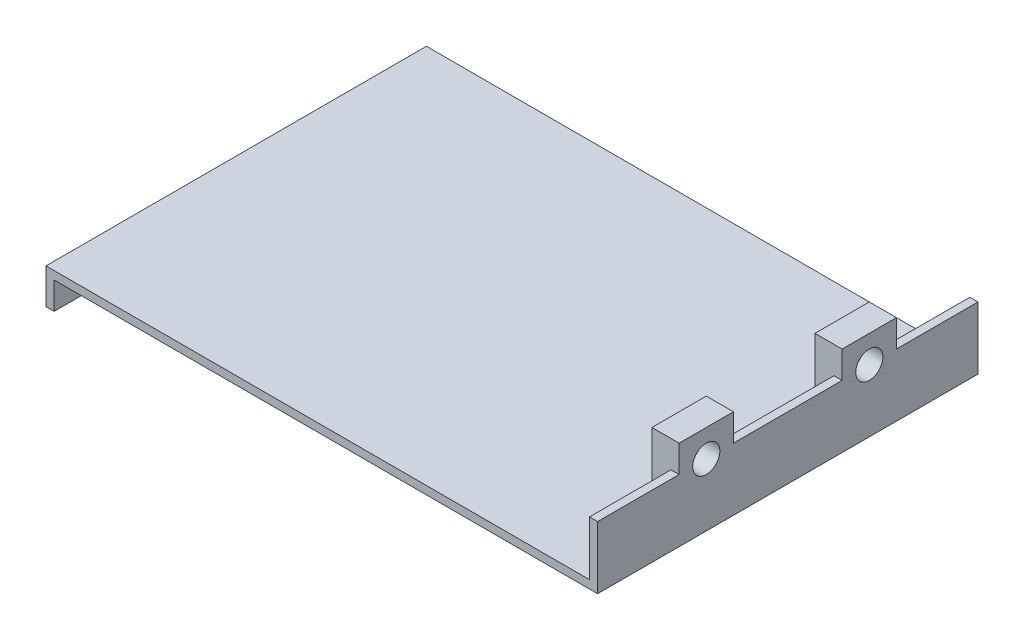
ISO-10303-21;
HEADER;
FILE_DESCRIPTION(('STEP AP214'),'2;1');
FILE_NAME('part.step','',(''),(''),'','','');
FILE_SCHEMA(('AUTOMOTIVE_DESIGN { 1 0 10303 214 1 1 1 1 }'));
ENDSEC;
DATA;
#1=APPLICATION_CONTEXT('core data for automotive mechanical design processes');
#2=APPLICATION_PROTOCOL_DEFINITION('international standard','automotive_design',2000,#1);
#3=PRODUCT_CONTEXT('',#1,'mechanical');
#4=PRODUCT('Part','Part','',(#3));
#5=PRODUCT_RELATED_PRODUCT_CATEGORY('part','',(#4));
#6=PRODUCT_DEFINITION_FORMATION('','',#4);
#7=PRODUCT_DEFINITION_CONTEXT('part definition',#1,'design');
#8=PRODUCT_DEFINITION('design','',#6,#7);
#9=PRODUCT_DEFINITION_SHAPE('','',#8);
#10=(LENGTH_UNIT() NAMED_UNIT(*) SI_UNIT(.MILLI.,.METRE.));
#11=(NAMED_UNIT(*) PLANE_ANGLE_UNIT() SI_UNIT($,.RADIAN.));
#12=(NAMED_UNIT(*) SI_UNIT($,.STERADIAN.) SOLID_ANGLE_UNIT());
#13=UNCERTAINTY_MEASURE_WITH_UNIT(LENGTH_MEASURE(1.E-05),#10,'distance_accuracy_value','');
#14=(GEOMETRIC_REPRESENTATION_CONTEXT(3) GLOBAL_UNCERTAINTY_ASSIGNED_CONTEXT((#13)) GLOBAL_UNIT_ASSIGNED_CONTEXT((#10,
#11,#12)) REPRESENTATION_CONTEXT('',''));
#15=CARTESIAN_POINT('',(0.,0.,0.));
#16=DIRECTION('',(0.,0.,1.));
#17=DIRECTION('',(1.,0.,0.));
#18=AXIS2_PLACEMENT_3D('',#15,#16,#17);
#19=CARTESIAN_POINT('',(0.,1.5,0.));
#20=DIRECTION('',(0.,1.,0.));
#21=DIRECTION('',(0.,0.,1.));
#22=AXIS2_PLACEMENT_3D('',#19,#20,#21);
#23=PLANE('',#22);
#24=DIRECTION('',(0.,0.,-1.));
#25=VECTOR('',#24,1.);
#26=CARTESIAN_POINT('',(35.34812024223,1.5,0.));
#27=LINE('',#26,#25);
#28=CARTESIAN_POINT('',(35.34812024223,1.5,4.92398703403566));
#29=VERTEX_POINT('',#28);
#30=CARTESIAN_POINT('',(35.34812024223,1.5,-15.0760129659643));
#31=VERTEX_POINT('',#30);
#32=EDGE_CURVE('E246',#29,#31,#27,.T.);
#33=ORIENTED_EDGE('',*,*,#32,.T.);
#34=DIRECTION('',(1.,0.,0.));
#35=VECTOR('',#34,1.);
#36=CARTESIAN_POINT('',(31.84812024223,1.5,-15.0760129659643));
#37=LINE('',#36,#35);
#38=CARTESIAN_POINT('',(31.84812024223,1.5,-15.0760129659643));
#39=VERTEX_POINT('',#38);
#40=EDGE_CURVE('E226',#39,#31,#37,.T.);
#41=ORIENTED_EDGE('',*,*,#40,.F.);
#42=DIRECTION('',(0.,0.,1.));
#43=VECTOR('',#42,1.);
#44=CARTESIAN_POINT('',(31.84812024223,1.5,0.));
#45=LINE('',#44,#43);
#46=CARTESIAN_POINT('',(31.84812024223,1.5,-25.0760129659643));
#47=VERTEX_POINT('',#46);
#48=EDGE_CURVE('E234',#47,#39,#45,.T.);
#49=ORIENTED_EDGE('',*,*,#48,.F.);
#50=DIRECTION('',(1.,0.,0.));
#51=VECTOR('',#50,1.);
#52=CARTESIAN_POINT('',(31.84812024223,1.5,-25.0760129659643));
#53=LINE('',#52,#51);
#54=CARTESIAN_POINT('',(35.34812024223,1.5,-25.0760129659643));
#55=VERTEX_POINT('',#54);
#56=EDGE_CURVE('E248',#47,#55,#53,.T.);
#57=ORIENTED_EDGE('',*,*,#56,.T.);
#58=CARTESIAN_POINT('',(35.34812024223,1.5,-40.0760129659643));
#59=VERTEX_POINT('',#58);
#60=EDGE_CURVE('E106',#55,#59,#27,.T.);
#61=ORIENTED_EDGE('',*,*,#60,.T.);
#62=DIRECTION('',(1.,0.,0.));
#63=VECTOR('',#62,1.);
#64=CARTESIAN_POINT('',(0.,1.5,-40.0760129659643));
#65=LINE('',#64,#63);
#66=CARTESIAN_POINT('',(-64.65187975777,1.5,-40.0760129659643));
#67=VERTEX_POINT('',#66);
#68=EDGE_CURVE('E327',#67,#59,#65,.T.);
#69=ORIENTED_EDGE('',*,*,#68,.F.);
#70=DIRECTION('',(0.,0.,1.));
#71=VECTOR('',#70,1.);
#72=CARTESIAN_POINT('',(-64.65187975777,1.5,-40.0760129659643));
#73=LINE('',#72,#71);
#74=CARTESIAN_POINT('',(-64.65187975777,1.5,29.9239870340357));
#75=VERTEX_POINT('',#74);
#76=EDGE_CURVE('E337',#67,#75,#73,.T.);
#77=ORIENTED_EDGE('',*,*,#76,.T.);
#78=DIRECTION('',(1.,0.,0.));
#79=VECTOR('',#78,1.);
#80=CARTESIAN_POINT('',(0.,1.5,29.9239870340357));
#81=LINE('',#80,#79);
#82=CARTESIAN_POINT('',(35.34812024223,1.5,29.9239870340357));
#83=VERTEX_POINT('',#82);
#84=EDGE_CURVE('E330',#75,#83,#81,.T.);
#85=ORIENTED_EDGE('',*,*,#84,.T.);
#86=CARTESIAN_POINT('',(35.34812024223,1.5,14.9239870340357));
#87=VERTEX_POINT('',#86);
#88=EDGE_CURVE('E307',#83,#87,#27,.T.);
#89=ORIENTED_EDGE('',*,*,#88,.T.);
#90=DIRECTION('',(1.,0.,0.));
#91=VECTOR('',#90,1.);
#92=CARTESIAN_POINT('',(31.84812024223,1.5,14.9239870340357));
#93=LINE('',#92,#91);
#94=CARTESIAN_POINT('',(31.84812024223,1.5,14.9239870340357));
#95=VERTEX_POINT('',#94);
#96=EDGE_CURVE('E264',#95,#87,#93,.T.);
#97=ORIENTED_EDGE('',*,*,#96,.F.);
#98=DIRECTION('',(0.,0.,1.));
#99=VECTOR('',#98,1.);
#100=CARTESIAN_POINT('',(31.84812024223,1.5,0.));
#101=LINE('',#100,#99);
#102=CARTESIAN_POINT('',(31.84812024223,1.5,4.92398703403566));
#103=VERTEX_POINT('',#102);
#104=EDGE_CURVE('E260',#103,#95,#101,.T.);
#105=ORIENTED_EDGE('',*,*,#104,.F.);
#106=DIRECTION('',(1.,0.,0.));
#107=VECTOR('',#106,1.);
#108=CARTESIAN_POINT('',(31.84812024223,1.5,4.92398703403566));
#109=LINE('',#108,#107);
#110=EDGE_CURVE('E269',#103,#29,#109,.T.);
#111=ORIENTED_EDGE('',*,*,#110,.T.);
#112=EDGE_LOOP('',(#33,#41,#49,#57,#61,#69,#77,#85,#89,#97,#105,#111));
#113=FACE_BOUND('',#112,.T.);
#114=ADVANCED_FACE('F83',(#113),#23,.T.);
#115=CARTESIAN_POINT('',(35.34812024223,11.5,0.));
#116=DIRECTION('',(-1.,0.,0.));
#117=DIRECTION('',(0.,0.,1.));
#118=AXIS2_PLACEMENT_3D('',#115,#116,#117);
#119=PLANE('',#118);
#120=DIRECTION('',(0.,0.,-1.));
#121=VECTOR('',#120,1.);
#122=CARTESIAN_POINT('',(35.34812024223,11.5,0.));
#123=LINE('',#122,#121);
#124=CARTESIAN_POINT('',(35.34812024223,11.5,4.92398703403566));
#125=VERTEX_POINT('',#124);
#126=CARTESIAN_POINT('',(35.34812024223,11.5,-15.0760129659643));
#127=VERTEX_POINT('',#126);
#128=EDGE_CURVE('E320',#125,#127,#123,.T.);
#129=ORIENTED_EDGE('',*,*,#128,.T.);
#130=DIRECTION('',(0.,1.,0.));
#131=VECTOR('',#130,1.);
#132=CARTESIAN_POINT('',(35.34812024223,11.5,-15.0760129659643));
#133=LINE('',#132,#131);
#134=EDGE_CURVE('E416',#31,#127,#133,.T.);
#135=ORIENTED_EDGE('',*,*,#134,.F.);
#136=ORIENTED_EDGE('',*,*,#32,.F.);
#137=DIRECTION('',(0.,-1.,0.));
#138=VECTOR('',#137,1.);
#139=CARTESIAN_POINT('',(35.34812024223,11.5,4.92398703403566));
#140=LINE('',#139,#138);
#141=EDGE_CURVE('E247',#125,#29,#140,.T.);
#142=ORIENTED_EDGE('',*,*,#141,.F.);
#143=EDGE_LOOP('',(#129,#135,#136,#142));
#144=FACE_BOUND('',#143,.T.);
#145=ADVANCED_FACE('F415',(#144),#119,.T.);
#146=DIRECTION('',(0.,1.,0.));
#147=VECTOR('',#146,1.);
#148=CARTESIAN_POINT('',(35.34812024223,11.5,-25.0760129659643));
#149=LINE('',#148,#147);
#150=CARTESIAN_POINT('',(35.34812024223,11.5,-25.0760129659643));
#151=VERTEX_POINT('',#150);
#152=EDGE_CURVE('E241',#55,#151,#149,.T.);
#153=ORIENTED_EDGE('',*,*,#152,.T.);
#154=CARTESIAN_POINT('',(35.34812024223,11.5,-40.0760129659643));
#155=VERTEX_POINT('',#154);
#156=EDGE_CURVE('E315',#151,#155,#123,.T.);
#157=ORIENTED_EDGE('',*,*,#156,.T.);
#158=DIRECTION('',(0.,-1.,0.));
#159=VECTOR('',#158,1.);
#160=CARTESIAN_POINT('',(35.34812024223,11.5,-40.0760129659643));
#161=LINE('',#160,#159);
#162=EDGE_CURVE('E323',#155,#59,#161,.T.);
#163=ORIENTED_EDGE('',*,*,#162,.T.);
#164=ORIENTED_EDGE('',*,*,#60,.F.);
#165=EDGE_LOOP('',(#153,#157,#163,#164));
#166=FACE_BOUND('',#165,.T.);
#167=ADVANCED_FACE('F466',(#166),#119,.T.);
#168=CARTESIAN_POINT('',(0.,11.5,0.));
#169=DIRECTION('',(0.,1.,0.));
#170=DIRECTION('',(0.,0.,1.));
#171=AXIS2_PLACEMENT_3D('',#168,#169,#170);
#172=PLANE('',#171);
#173=DIRECTION('',(0.,0.,-1.));
#174=VECTOR('',#173,1.);
#175=CARTESIAN_POINT('',(36.84812024223,11.5,0.));
#176=LINE('',#175,#174);
#177=CARTESIAN_POINT('',(36.84812024223,11.5,4.92398703403566));
#178=VERTEX_POINT('',#177);
#179=CARTESIAN_POINT('',(36.84812024223,11.5,-15.0760129659643));
#180=VERTEX_POINT('',#179);
#181=EDGE_CURVE('E312',#178,#180,#176,.T.);
#182=ORIENTED_EDGE('',*,*,#181,.T.);
#183=DIRECTION('',(1.,0.,0.));
#184=VECTOR('',#183,1.);
#185=CARTESIAN_POINT('',(35.34812024223,11.5,-15.0760129659643));
#186=LINE('',#185,#184);
#187=EDGE_CURVE('E280',#127,#180,#186,.T.);
#188=ORIENTED_EDGE('',*,*,#187,.F.);
#189=ORIENTED_EDGE('',*,*,#128,.F.);
#190=DIRECTION('',(1.,0.,0.));
#191=VECTOR('',#190,1.);
#192=CARTESIAN_POINT('',(35.34812024223,11.5,4.92398703403566));
#193=LINE('',#192,#191);
#194=EDGE_CURVE('E300',#125,#178,#193,.T.);
#195=ORIENTED_EDGE('',*,*,#194,.T.);
#196=EDGE_LOOP('',(#182,#188,#189,#195));
#197=FACE_BOUND('',#196,.T.);
#198=ADVANCED_FACE('F487',(#197),#172,.T.);
#199=DIRECTION('',(1.,0.,0.));
#200=VECTOR('',#199,1.);
#201=CARTESIAN_POINT('',(35.34812024223,11.5,-25.0760129659643));
#202=LINE('',#201,#200);
#203=CARTESIAN_POINT('',(36.84812024223,11.5,-25.0760129659643));
#204=VERTEX_POINT('',#203);
#205=EDGE_CURVE('E279',#151,#204,#202,.T.);
#206=ORIENTED_EDGE('',*,*,#205,.T.);
#207=CARTESIAN_POINT('',(36.84812024223,11.5,-40.0760129659643));
#208=VERTEX_POINT('',#207);
#209=EDGE_CURVE('E306',#204,#208,#176,.T.);
#210=ORIENTED_EDGE('',*,*,#209,.T.);
#211=DIRECTION('',(1.,0.,0.));
#212=VECTOR('',#211,1.);
#213=CARTESIAN_POINT('',(0.,11.5,-40.0760129659643));
#214=LINE('',#213,#212);
#215=EDGE_CURVE('E303',#155,#208,#214,.T.);
#216=ORIENTED_EDGE('',*,*,#215,.F.);
#217=ORIENTED_EDGE('',*,*,#156,.F.);
#218=EDGE_LOOP('',(#206,#210,#216,#217));
#219=FACE_BOUND('',#218,.T.);
#220=ADVANCED_FACE('F483',(#219),#172,.T.);
#221=CARTESIAN_POINT('',(-63.15187975777,-5.,-40.0760129659643));
#222=DIRECTION('',(-1.,0.,0.));
#223=DIRECTION('',(0.,0.,1.));
#224=AXIS2_PLACEMENT_3D('',#221,#222,#223);
#225=PLANE('',#224);
#226=DIRECTION('',(0.,0.,1.));
#227=VECTOR('',#226,1.);
#228=CARTESIAN_POINT('',(-63.15187975777,0.,-40.0760129659643));
#229=LINE('',#228,#227);
#230=CARTESIAN_POINT('',(-63.15187975777,0.,-40.0760129659643));
#231=VERTEX_POINT('',#230);
#232=CARTESIAN_POINT('',(-63.15187975777,0.,29.9239870340357));
#233=VERTEX_POINT('',#232);
#234=EDGE_CURVE('E334',#231,#233,#229,.T.);
#235=ORIENTED_EDGE('',*,*,#234,.T.);
#236=DIRECTION('',(0.,1.,0.));
#237=VECTOR('',#236,1.);
#238=CARTESIAN_POINT('',(-63.15187975777,-5.,29.9239870340357));
#239=LINE('',#238,#237);
#240=CARTESIAN_POINT('',(-63.15187975777,-5.,29.9239870340357));
#241=VERTEX_POINT('',#240);
#242=EDGE_CURVE('E12',#241,#233,#239,.T.);
#243=ORIENTED_EDGE('',*,*,#242,.F.);
#244=DIRECTION('',(0.,0.,1.));
#245=VECTOR('',#244,1.);
#246=CARTESIAN_POINT('',(-63.15187975777,-5.,-40.0760129659643));
#247=LINE('',#246,#245);
#248=CARTESIAN_POINT('',(-63.15187975777,-5.,-40.0760129659643));
#249=VERTEX_POINT('',#248);
#250=EDGE_CURVE('E349',#249,#241,#247,.T.);
#251=ORIENTED_EDGE('',*,*,#250,.F.);
#252=DIRECTION('',(0.,1.,0.));
#253=VECTOR('',#252,1.);
#254=CARTESIAN_POINT('',(-63.15187975777,-5.,-40.0760129659643));
#255=LINE('',#254,#253);
#256=EDGE_CURVE('E360',#249,#231,#255,.T.);
#257=ORIENTED_EDGE('',*,*,#256,.T.);
#258=EDGE_LOOP('',(#235,#243,#251,#257));
#259=FACE_BOUND('',#258,.T.);
#260=ADVANCED_FACE('F85',(#259),#225,.F.);
#261=CARTESIAN_POINT('',(-63.15187975777,-5.,29.9239870340357));
#262=DIRECTION('',(0.,0.,-1.));
#263=DIRECTION('',(-1.,0.,0.));
#264=AXIS2_PLACEMENT_3D('',#261,#262,#263);
#265=PLANE('',#264);
#266=ORIENTED_EDGE('',*,*,#242,.T.);
#267=DIRECTION('',(1.,0.,0.));
#268=VECTOR('',#267,1.);
#269=CARTESIAN_POINT('',(0.,0.,29.9239870340357));
#270=LINE('',#269,#268);
#271=CARTESIAN_POINT('',(36.84812024223,0.,29.9239870340357));
#272=VERTEX_POINT('',#271);
#273=EDGE_CURVE('E331',#233,#272,#270,.T.);
#274=ORIENTED_EDGE('',*,*,#273,.T.);
#275=DIRECTION('',(0.,-1.,0.));
#276=VECTOR('',#275,1.);
#277=CARTESIAN_POINT('',(36.84812024223,1.5,29.9239870340357));
#278=LINE('',#277,#276);
#279=CARTESIAN_POINT('',(36.84812024223,11.5,29.9239870340357));
#280=VERTEX_POINT('',#279);
#281=EDGE_CURVE('E344',#280,#272,#278,.T.);
#282=ORIENTED_EDGE('',*,*,#281,.F.);
#283=DIRECTION('',(1.,0.,0.));
#284=VECTOR('',#283,1.);
#285=CARTESIAN_POINT('',(0.,11.5,29.9239870340357));
#286=LINE('',#285,#284);
#287=CARTESIAN_POINT('',(35.34812024223,11.5,29.9239870340357));
#288=VERTEX_POINT('',#287);
#289=EDGE_CURVE('E311',#288,#280,#286,.T.);
#290=ORIENTED_EDGE('',*,*,#289,.F.);
#291=DIRECTION('',(0.,-1.,0.));
#292=VECTOR('',#291,1.);
#293=CARTESIAN_POINT('',(35.34812024223,11.5,29.9239870340357));
#294=LINE('',#293,#292);
#295=EDGE_CURVE('E319',#288,#83,#294,.T.);
#296=ORIENTED_EDGE('',*,*,#295,.T.);
#297=ORIENTED_EDGE('',*,*,#84,.F.);
#298=DIRECTION('',(0.,1.,0.));
#299=VECTOR('',#298,1.);
#300=CARTESIAN_POINT('',(-64.65187975777,-5.,29.9239870340357));
#301=LINE('',#300,#299);
#302=CARTESIAN_POINT('',(-64.65187975777,-5.,29.9239870340357));
#303=VERTEX_POINT('',#302);
#304=EDGE_CURVE('E91',#303,#75,#301,.T.);
#305=ORIENTED_EDGE('',*,*,#304,.F.);
#306=DIRECTION('',(-1.,0.,0.));
#307=VECTOR('',#306,1.);
#308=CARTESIAN_POINT('',(-63.15187975777,-5.,29.9239870340357));
#309=LINE('',#308,#307);
#310=EDGE_CURVE('E352',#241,#303,#309,.T.);
#311=ORIENTED_EDGE('',*,*,#310,.F.);
#312=EDGE_LOOP('',(#266,#274,#282,#290,#296,#297,#305,#311));
#313=FACE_BOUND('',#312,.T.);
#314=ADVANCED_FACE('F373',(#313),#265,.F.);
#315=CARTESIAN_POINT('',(-64.65187975777,-5.,-40.0760129659643));
#316=DIRECTION('',(-1.,0.,0.));
#317=DIRECTION('',(0.,0.,1.));
#318=AXIS2_PLACEMENT_3D('',#315,#316,#317);
#319=PLANE('',#318);
#320=ORIENTED_EDGE('',*,*,#304,.T.);
#321=ORIENTED_EDGE('',*,*,#76,.F.);
#322=DIRECTION('',(0.,1.,0.));
#323=VECTOR('',#322,1.);
#324=CARTESIAN_POINT('',(-64.65187975777,-5.,-40.0760129659643));
#325=LINE('',#324,#323);
#326=CARTESIAN_POINT('',(-64.65187975777,-5.,-40.0760129659643));
#327=VERTEX_POINT('',#326);
#328=EDGE_CURVE('E365',#327,#67,#325,.T.);
#329=ORIENTED_EDGE('',*,*,#328,.F.);
#330=DIRECTION('',(0.,0.,1.));
#331=VECTOR('',#330,1.);
#332=CARTESIAN_POINT('',(-64.65187975777,-5.,-40.0760129659643));
#333=LINE('',#332,#331);
#334=EDGE_CURVE('E354',#327,#303,#333,.T.);
#335=ORIENTED_EDGE('',*,*,#334,.T.);
#336=EDGE_LOOP('',(#320,#321,#329,#335));
#337=FACE_BOUND('',#336,.T.);
#338=ADVANCED_FACE('F370',(#337),#319,.T.);
#339=CARTESIAN_POINT('',(-63.15187975777,-5.,-40.0760129659643));
#340=DIRECTION('',(0.,0.,-1.));
#341=DIRECTION('',(-1.,0.,0.));
#342=AXIS2_PLACEMENT_3D('',#339,#340,#341);
#343=PLANE('',#342);
#344=ORIENTED_EDGE('',*,*,#328,.T.);
#345=ORIENTED_EDGE('',*,*,#68,.T.);
#346=ORIENTED_EDGE('',*,*,#162,.F.);
#347=ORIENTED_EDGE('',*,*,#215,.T.);
#348=DIRECTION('',(0.,-1.,0.));
#349=VECTOR('',#348,1.);
#350=CARTESIAN_POINT('',(36.84812024223,1.5,-40.0760129659643));
#351=LINE('',#350,#349);
#352=CARTESIAN_POINT('',(36.84812024223,0.,-40.0760129659643));
#353=VERTEX_POINT('',#352);
#354=EDGE_CURVE('E341',#208,#353,#351,.T.);
#355=ORIENTED_EDGE('',*,*,#354,.T.);
#356=DIRECTION('',(1.,0.,0.));
#357=VECTOR('',#356,1.);
#358=CARTESIAN_POINT('',(0.,0.,-40.0760129659643));
#359=LINE('',#358,#357);
#360=EDGE_CURVE('E335',#231,#353,#359,.T.);
#361=ORIENTED_EDGE('',*,*,#360,.F.);
#362=ORIENTED_EDGE('',*,*,#256,.F.);
#363=DIRECTION('',(-1.,0.,0.));
#364=VECTOR('',#363,1.);
#365=CARTESIAN_POINT('',(-63.15187975777,-5.,-40.0760129659643));
#366=LINE('',#365,#364);
#367=EDGE_CURVE('E357',#249,#327,#366,.T.);
#368=ORIENTED_EDGE('',*,*,#367,.T.);
#369=EDGE_LOOP('',(#344,#345,#346,#347,#355,#361,#362,#368));
#370=FACE_BOUND('',#369,.T.);
#371=ADVANCED_FACE('F378',(#370),#343,.T.);
#372=CARTESIAN_POINT('',(0.,-5.,0.));
#373=DIRECTION('',(0.,-1.,0.));
#374=DIRECTION('',(0.,0.,-1.));
#375=AXIS2_PLACEMENT_3D('',#372,#373,#374);
#376=PLANE('',#375);
#377=ORIENTED_EDGE('',*,*,#250,.T.);
#378=ORIENTED_EDGE('',*,*,#310,.T.);
#379=ORIENTED_EDGE('',*,*,#334,.F.);
#380=ORIENTED_EDGE('',*,*,#367,.F.);
#381=EDGE_LOOP('',(#377,#378,#379,#380));
#382=FACE_BOUND('',#381,.T.);
#383=ADVANCED_FACE('F382',(#382),#376,.T.);
#384=CARTESIAN_POINT('',(0.,0.,0.));
#385=DIRECTION('',(0.,1.,0.));
#386=DIRECTION('',(0.,0.,1.));
#387=AXIS2_PLACEMENT_3D('',#384,#385,#386);
#388=PLANE('',#387);
#389=ORIENTED_EDGE('',*,*,#234,.F.);
#390=ORIENTED_EDGE('',*,*,#360,.T.);
#391=DIRECTION('',(0.,0.,1.));
#392=VECTOR('',#391,1.);
#393=CARTESIAN_POINT('',(36.84812024223,0.,-40.0760129659643));
#394=LINE('',#393,#392);
#395=EDGE_CURVE('E325',#353,#272,#394,.T.);
#396=ORIENTED_EDGE('',*,*,#395,.T.);
#397=ORIENTED_EDGE('',*,*,#273,.F.);
#398=EDGE_LOOP('',(#389,#390,#396,#397));
#399=FACE_BOUND('',#398,.T.);
#400=ADVANCED_FACE('F388',(#399),#388,.F.);
#401=CARTESIAN_POINT('',(36.84812024223,1.5,-40.0760129659643));
#402=DIRECTION('',(1.,0.,0.));
#403=DIRECTION('',(0.,0.,-1.));
#404=AXIS2_PLACEMENT_3D('',#401,#402,#403);
#405=PLANE('',#404);
#406=CARTESIAN_POINT('',(36.84812024223,11.5,-20.0760129659643));
#407=DIRECTION('',(-1.,0.,0.));
#408=DIRECTION('',(0.,0.,1.));
#409=AXIS2_PLACEMENT_3D('',#406,#407,#408);
#410=CIRCLE('',#409,2.5);
#411=CARTESIAN_POINT('',(36.84812024223,11.5,-17.5760129659643));
#412=VERTEX_POINT('',#411);
#413=EDGE_CURVE('E441',#412,#412,#410,.T.);
#414=ORIENTED_EDGE('',*,*,#413,.T.);
#415=EDGE_LOOP('',(#414));
#416=FACE_BOUND('',#415,.T.);
#417=CARTESIAN_POINT('',(36.84812024223,11.5,9.92398703403566));
#418=DIRECTION('',(-1.,0.,0.));
#419=DIRECTION('',(0.,0.,1.));
#420=AXIS2_PLACEMENT_3D('',#417,#418,#419);
#421=CIRCLE('',#420,2.5);
#422=CARTESIAN_POINT('',(36.84812024223,11.5,12.4239870340357));
#423=VERTEX_POINT('',#422);
#424=EDGE_CURVE('E442',#423,#423,#421,.T.);
#425=ORIENTED_EDGE('',*,*,#424,.T.);
#426=EDGE_LOOP('',(#425));
#427=FACE_BOUND('',#426,.T.);
#428=ORIENTED_EDGE('',*,*,#395,.F.);
#429=ORIENTED_EDGE('',*,*,#354,.F.);
#430=ORIENTED_EDGE('',*,*,#209,.F.);
#431=DIRECTION('',(0.,1.,0.));
#432=VECTOR('',#431,1.);
#433=CARTESIAN_POINT('',(36.84812024223,0.,-25.0760129659643));
#434=LINE('',#433,#432);
#435=CARTESIAN_POINT('',(36.84812024223,16.5,-25.0760129659643));
#436=VERTEX_POINT('',#435);
#437=EDGE_CURVE('E271',#204,#436,#434,.T.);
#438=ORIENTED_EDGE('',*,*,#437,.T.);
#439=DIRECTION('',(0.,0.,-1.));
#440=VECTOR('',#439,1.);
#441=CARTESIAN_POINT('',(36.84812024223,16.5,0.));
#442=LINE('',#441,#440);
#443=CARTESIAN_POINT('',(36.84812024223,16.5,-15.0760129659643));
#444=VERTEX_POINT('',#443);
#445=EDGE_CURVE('E274',#444,#436,#442,.T.);
#446=ORIENTED_EDGE('',*,*,#445,.F.);
#447=DIRECTION('',(0.,1.,0.));
#448=VECTOR('',#447,1.);
#449=CARTESIAN_POINT('',(36.84812024223,0.,-15.0760129659643));
#450=LINE('',#449,#448);
#451=EDGE_CURVE('E277',#180,#444,#450,.T.);
#452=ORIENTED_EDGE('',*,*,#451,.F.);
#453=ORIENTED_EDGE('',*,*,#181,.F.);
#454=DIRECTION('',(0.,1.,0.));
#455=VECTOR('',#454,1.);
#456=CARTESIAN_POINT('',(36.84812024223,0.,4.92398703403566));
#457=LINE('',#456,#455);
#458=CARTESIAN_POINT('',(36.84812024223,16.5,4.92398703403566));
#459=VERTEX_POINT('',#458);
#460=EDGE_CURVE('E98',#178,#459,#457,.T.);
#461=ORIENTED_EDGE('',*,*,#460,.T.);
#462=DIRECTION('',(0.,0.,1.));
#463=VECTOR('',#462,1.);
#464=CARTESIAN_POINT('',(36.84812024223,16.5,0.));
#465=LINE('',#464,#463);
#466=CARTESIAN_POINT('',(36.84812024223,16.5,14.9239870340357));
#467=VERTEX_POINT('',#466);
#468=EDGE_CURVE('E292',#459,#467,#465,.T.);
#469=ORIENTED_EDGE('',*,*,#468,.T.);
#470=DIRECTION('',(0.,1.,0.));
#471=VECTOR('',#470,1.);
#472=CARTESIAN_POINT('',(36.84812024223,0.,14.9239870340357));
#473=LINE('',#472,#471);
#474=CARTESIAN_POINT('',(36.84812024223,11.5,14.9239870340357));
#475=VERTEX_POINT('',#474);
#476=EDGE_CURVE('E283',#475,#467,#473,.T.);
#477=ORIENTED_EDGE('',*,*,#476,.F.);
#478=EDGE_CURVE('E308',#280,#475,#176,.T.);
#479=ORIENTED_EDGE('',*,*,#478,.F.);
#480=ORIENTED_EDGE('',*,*,#281,.T.);
#481=EDGE_LOOP('',(#428,#429,#430,#438,#446,#452,#453,#461,#469,#477,#479,#480));
#482=FACE_BOUND('',#481,.T.);
#483=ADVANCED_FACE('F393',(#416,#427,#482),#405,.T.);
#484=DIRECTION('',(0.,-1.,0.));
#485=VECTOR('',#484,1.);
#486=CARTESIAN_POINT('',(35.34812024223,11.5,14.9239870340357));
#487=LINE('',#486,#485);
#488=CARTESIAN_POINT('',(35.34812024223,11.5,14.9239870340357));
#489=VERTEX_POINT('',#488);
#490=EDGE_CURVE('E250',#489,#87,#487,.T.);
#491=ORIENTED_EDGE('',*,*,#490,.T.);
#492=ORIENTED_EDGE('',*,*,#88,.F.);
#493=ORIENTED_EDGE('',*,*,#295,.F.);
#494=EDGE_CURVE('E316',#288,#489,#123,.T.);
#495=ORIENTED_EDGE('',*,*,#494,.T.);
#496=EDGE_LOOP('',(#491,#492,#493,#495));
#497=FACE_BOUND('',#496,.T.);
#498=ADVANCED_FACE('F401',(#497),#119,.T.);
#499=DIRECTION('',(1.,0.,0.));
#500=VECTOR('',#499,1.);
#501=CARTESIAN_POINT('',(35.34812024223,11.5,14.9239870340357));
#502=LINE('',#501,#500);
#503=EDGE_CURVE('E295',#489,#475,#502,.T.);
#504=ORIENTED_EDGE('',*,*,#503,.F.);
#505=ORIENTED_EDGE('',*,*,#494,.F.);
#506=ORIENTED_EDGE('',*,*,#289,.T.);
#507=ORIENTED_EDGE('',*,*,#478,.T.);
#508=EDGE_LOOP('',(#504,#505,#506,#507));
#509=FACE_BOUND('',#508,.T.);
#510=ADVANCED_FACE('F399',(#509),#172,.T.);
#511=CARTESIAN_POINT('',(35.34812024223,0.,14.9239870340357));
#512=DIRECTION('',(0.,0.,-1.));
#513=DIRECTION('',(-1.,0.,0.));
#514=AXIS2_PLACEMENT_3D('',#511,#512,#513);
#515=PLANE('',#514);
#516=ORIENTED_EDGE('',*,*,#476,.T.);
#517=DIRECTION('',(1.,0.,0.));
#518=VECTOR('',#517,1.);
#519=CARTESIAN_POINT('',(35.34812024223,16.5,14.9239870340357));
#520=LINE('',#519,#518);
#521=CARTESIAN_POINT('',(31.84812024223,16.5,14.9239870340357));
#522=VERTEX_POINT('',#521);
#523=EDGE_CURVE('E296',#522,#467,#520,.T.);
#524=ORIENTED_EDGE('',*,*,#523,.F.);
#525=DIRECTION('',(0.,-1.,0.));
#526=VECTOR('',#525,1.);
#527=CARTESIAN_POINT('',(31.84812024223,11.5,14.9239870340357));
#528=LINE('',#527,#526);
#529=EDGE_CURVE('E262',#522,#95,#528,.T.);
#530=ORIENTED_EDGE('',*,*,#529,.T.);
#531=ORIENTED_EDGE('',*,*,#96,.T.);
#532=ORIENTED_EDGE('',*,*,#490,.F.);
#533=ORIENTED_EDGE('',*,*,#503,.T.);
#534=EDGE_LOOP('',(#516,#524,#530,#531,#532,#533));
#535=FACE_BOUND('',#534,.T.);
#536=ADVANCED_FACE('F405',(#535),#515,.F.);
#537=CARTESIAN_POINT('',(35.34812024223,16.5,0.));
#538=DIRECTION('',(0.,1.,0.));
#539=DIRECTION('',(0.,0.,1.));
#540=AXIS2_PLACEMENT_3D('',#537,#538,#539);
#541=PLANE('',#540);
#542=ORIENTED_EDGE('',*,*,#468,.F.);
#543=DIRECTION('',(1.,0.,0.));
#544=VECTOR('',#543,1.);
#545=CARTESIAN_POINT('',(35.34812024223,16.5,4.92398703403566));
#546=LINE('',#545,#544);
#547=CARTESIAN_POINT('',(31.84812024223,16.5,4.92398703403566));
#548=VERTEX_POINT('',#547);
#549=EDGE_CURVE('E298',#548,#459,#546,.T.);
#550=ORIENTED_EDGE('',*,*,#549,.F.);
#551=DIRECTION('',(0.,0.,-1.));
#552=VECTOR('',#551,1.);
#553=CARTESIAN_POINT('',(31.84812024223,16.5,0.));
#554=LINE('',#553,#552);
#555=EDGE_CURVE('E255',#522,#548,#554,.T.);
#556=ORIENTED_EDGE('',*,*,#555,.F.);
#557=ORIENTED_EDGE('',*,*,#523,.T.);
#558=EDGE_LOOP('',(#542,#550,#556,#557));
#559=FACE_BOUND('',#558,.T.);
#560=ADVANCED_FACE('F499',(#559),#541,.T.);
#561=CARTESIAN_POINT('',(35.34812024223,0.,4.92398703403566));
#562=DIRECTION('',(0.,0.,-1.));
#563=DIRECTION('',(-1.,0.,0.));
#564=AXIS2_PLACEMENT_3D('',#561,#562,#563);
#565=PLANE('',#564);
#566=ORIENTED_EDGE('',*,*,#460,.F.);
#567=ORIENTED_EDGE('',*,*,#194,.F.);
#568=ORIENTED_EDGE('',*,*,#141,.T.);
#569=ORIENTED_EDGE('',*,*,#110,.F.);
#570=DIRECTION('',(0.,-1.,0.));
#571=VECTOR('',#570,1.);
#572=CARTESIAN_POINT('',(31.84812024223,11.5,4.92398703403566));
#573=LINE('',#572,#571);
#574=EDGE_CURVE('E258',#548,#103,#573,.T.);
#575=ORIENTED_EDGE('',*,*,#574,.F.);
#576=ORIENTED_EDGE('',*,*,#549,.T.);
#577=EDGE_LOOP('',(#566,#567,#568,#569,#575,#576));
#578=FACE_BOUND('',#577,.T.);
#579=ADVANCED_FACE('F412',(#578),#565,.T.);
#580=CARTESIAN_POINT('',(35.34812024223,0.,-15.0760129659643));
#581=DIRECTION('',(0.,0.,-1.));
#582=DIRECTION('',(-1.,0.,0.));
#583=AXIS2_PLACEMENT_3D('',#580,#581,#582);
#584=PLANE('',#583);
#585=ORIENTED_EDGE('',*,*,#451,.T.);
#586=DIRECTION('',(1.,0.,0.));
#587=VECTOR('',#586,1.);
#588=CARTESIAN_POINT('',(35.34812024223,16.5,-15.0760129659643));
#589=LINE('',#588,#587);
#590=CARTESIAN_POINT('',(31.84812024223,16.5,-15.0760129659643));
#591=VERTEX_POINT('',#590);
#592=EDGE_CURVE('E229',#591,#444,#589,.T.);
#593=ORIENTED_EDGE('',*,*,#592,.F.);
#594=DIRECTION('',(0.,1.,0.));
#595=VECTOR('',#594,1.);
#596=CARTESIAN_POINT('',(31.84812024223,11.5,-15.0760129659643));
#597=LINE('',#596,#595);
#598=EDGE_CURVE('E222',#39,#591,#597,.T.);
#599=ORIENTED_EDGE('',*,*,#598,.F.);
#600=ORIENTED_EDGE('',*,*,#40,.T.);
#601=ORIENTED_EDGE('',*,*,#134,.T.);
#602=ORIENTED_EDGE('',*,*,#187,.T.);
#603=EDGE_LOOP('',(#585,#593,#599,#600,#601,#602));
#604=FACE_BOUND('',#603,.T.);
#605=ADVANCED_FACE('F224',(#604),#584,.F.);
#606=CARTESIAN_POINT('',(35.34812024223,16.5,0.));
#607=DIRECTION('',(0.,-1.,0.));
#608=DIRECTION('',(0.,0.,-1.));
#609=AXIS2_PLACEMENT_3D('',#606,#607,#608);
#610=PLANE('',#609);
#611=ORIENTED_EDGE('',*,*,#445,.T.);
#612=DIRECTION('',(1.,0.,0.));
#613=VECTOR('',#612,1.);
#614=CARTESIAN_POINT('',(35.34812024223,16.5,-25.0760129659643));
#615=LINE('',#614,#613);
#616=CARTESIAN_POINT('',(31.84812024223,16.5,-25.0760129659643));
#617=VERTEX_POINT('',#616);
#618=EDGE_CURVE('E285',#617,#436,#615,.T.);
#619=ORIENTED_EDGE('',*,*,#618,.F.);
#620=DIRECTION('',(0.,0.,1.));
#621=VECTOR('',#620,1.);
#622=CARTESIAN_POINT('',(31.84812024223,16.5,0.));
#623=LINE('',#622,#621);
#624=EDGE_CURVE('E233',#617,#591,#623,.T.);
#625=ORIENTED_EDGE('',*,*,#624,.T.);
#626=ORIENTED_EDGE('',*,*,#592,.T.);
#627=EDGE_LOOP('',(#611,#619,#625,#626));
#628=FACE_BOUND('',#627,.T.);
#629=ADVANCED_FACE('F515',(#628),#610,.F.);
#630=CARTESIAN_POINT('',(35.34812024223,0.,-25.0760129659643));
#631=DIRECTION('',(0.,0.,-1.));
#632=DIRECTION('',(-1.,0.,0.));
#633=AXIS2_PLACEMENT_3D('',#630,#631,#632);
#634=PLANE('',#633);
#635=ORIENTED_EDGE('',*,*,#437,.F.);
#636=ORIENTED_EDGE('',*,*,#205,.F.);
#637=ORIENTED_EDGE('',*,*,#152,.F.);
#638=ORIENTED_EDGE('',*,*,#56,.F.);
#639=DIRECTION('',(0.,1.,0.));
#640=VECTOR('',#639,1.);
#641=CARTESIAN_POINT('',(31.84812024223,11.5,-25.0760129659643));
#642=LINE('',#641,#640);
#643=EDGE_CURVE('E240',#47,#617,#642,.T.);
#644=ORIENTED_EDGE('',*,*,#643,.T.);
#645=ORIENTED_EDGE('',*,*,#618,.T.);
#646=EDGE_LOOP('',(#635,#636,#637,#638,#644,#645));
#647=FACE_BOUND('',#646,.T.);
#648=ADVANCED_FACE('F509',(#647),#634,.T.);
#649=CARTESIAN_POINT('',(31.84812024223,0.,0.));
#650=DIRECTION('',(-1.,0.,0.));
#651=DIRECTION('',(0.,0.,1.));
#652=AXIS2_PLACEMENT_3D('',#649,#650,#651);
#653=PLANE('',#652);
#654=CARTESIAN_POINT('',(31.84812024223,11.5,9.92398703403566));
#655=DIRECTION('',(-1.,0.,0.));
#656=DIRECTION('',(0.,0.,1.));
#657=AXIS2_PLACEMENT_3D('',#654,#655,#656);
#658=CIRCLE('',#657,4.95);
#659=CARTESIAN_POINT('',(31.84812024223,11.5,14.8739870340357));
#660=VERTEX_POINT('',#659);
#661=EDGE_CURVE('E427',#660,#660,#658,.T.);
#662=ORIENTED_EDGE('',*,*,#661,.F.);
#663=EDGE_LOOP('',(#662));
#664=FACE_BOUND('',#663,.T.);
#665=ORIENTED_EDGE('',*,*,#555,.T.);
#666=ORIENTED_EDGE('',*,*,#574,.T.);
#667=ORIENTED_EDGE('',*,*,#104,.T.);
#668=ORIENTED_EDGE('',*,*,#529,.F.);
#669=EDGE_LOOP('',(#665,#666,#667,#668));
#670=FACE_BOUND('',#669,.T.);
#671=ADVANCED_FACE('F409',(#664,#670),#653,.T.);
#672=CARTESIAN_POINT('',(31.84812024223,0.,0.));
#673=DIRECTION('',(-1.,0.,0.));
#674=DIRECTION('',(0.,0.,1.));
#675=AXIS2_PLACEMENT_3D('',#672,#673,#674);
#676=PLANE('',#675);
#677=CARTESIAN_POINT('',(31.84812024223,11.5,-20.0760129659643));
#678=DIRECTION('',(-1.,0.,0.));
#679=DIRECTION('',(0.,0.,1.));
#680=AXIS2_PLACEMENT_3D('',#677,#678,#679);
#681=CIRCLE('',#680,4.95);
#682=CARTESIAN_POINT('',(31.84812024223,11.5,-15.1260129659643));
#683=VERTEX_POINT('',#682);
#684=EDGE_CURVE('E422',#683,#683,#681,.T.);
#685=ORIENTED_EDGE('',*,*,#684,.F.);
#686=EDGE_LOOP('',(#685));
#687=FACE_BOUND('',#686,.T.);
#688=ORIENTED_EDGE('',*,*,#48,.T.);
#689=ORIENTED_EDGE('',*,*,#598,.T.);
#690=ORIENTED_EDGE('',*,*,#624,.F.);
#691=ORIENTED_EDGE('',*,*,#643,.F.);
#692=EDGE_LOOP('',(#688,#689,#690,#691));
#693=FACE_BOUND('',#692,.T.);
#694=ADVANCED_FACE('F238',(#687,#693),#676,.T.);
#695=CARTESIAN_POINT('',(33.34812024223,11.5,-20.0760129659643));
#696=DIRECTION('',(-1.,0.,0.));
#697=DIRECTION('',(0.,0.,1.));
#698=AXIS2_PLACEMENT_3D('',#695,#696,#697);
#699=CYLINDRICAL_SURFACE('',#698,4.95);
#700=CARTESIAN_POINT('',(33.34812024223,11.5,-20.0760129659643));
#701=DIRECTION('',(-1.,0.,0.));
#702=DIRECTION('',(0.,0.,1.));
#703=AXIS2_PLACEMENT_3D('',#700,#701,#702);
#704=CIRCLE('',#703,4.95);
#705=CARTESIAN_POINT('',(33.34812024223,11.5,-15.1260129659643));
#706=VERTEX_POINT('',#705);
#707=EDGE_CURVE('E419',#706,#706,#704,.T.);
#708=ORIENTED_EDGE('',*,*,#707,.F.);
#709=EDGE_LOOP('',(#708));
#710=FACE_BOUND('',#709,.T.);
#711=ORIENTED_EDGE('',*,*,#684,.T.);
#712=EDGE_LOOP('',(#711));
#713=FACE_BOUND('',#712,.T.);
#714=ADVANCED_FACE('F571',(#710,#713),#699,.F.);
#715=CARTESIAN_POINT('',(33.34812024223,11.5,-20.0760129659643));
#716=DIRECTION('',(-1.,0.,0.));
#717=DIRECTION('',(0.,0.,1.));
#718=AXIS2_PLACEMENT_3D('',#715,#716,#717);
#719=PLANE('',#718);
#720=CARTESIAN_POINT('',(33.34812024223,11.5,-20.0760129659643));
#721=DIRECTION('',(-1.,0.,0.));
#722=DIRECTION('',(0.,0.,1.));
#723=AXIS2_PLACEMENT_3D('',#720,#721,#722);
#724=CIRCLE('',#723,2.5);
#725=CARTESIAN_POINT('',(33.34812024223,11.5,-17.5760129659643));
#726=VERTEX_POINT('',#725);
#727=EDGE_CURVE('E431',#726,#726,#724,.T.);
#728=ORIENTED_EDGE('',*,*,#727,.F.);
#729=EDGE_LOOP('',(#728));
#730=FACE_BOUND('',#729,.T.);
#731=ORIENTED_EDGE('',*,*,#707,.T.);
#732=EDGE_LOOP('',(#731));
#733=FACE_BOUND('',#732,.T.);
#734=ADVANCED_FACE('F582',(#730,#733),#719,.T.);
#735=CARTESIAN_POINT('',(33.34812024223,11.5,9.92398703403566));
#736=DIRECTION('',(-1.,0.,0.));
#737=DIRECTION('',(0.,0.,1.));
#738=AXIS2_PLACEMENT_3D('',#735,#736,#737);
#739=CYLINDRICAL_SURFACE('',#738,4.95);
#740=CARTESIAN_POINT('',(33.34812024223,11.5,9.92398703403566));
#741=DIRECTION('',(-1.,0.,0.));
#742=DIRECTION('',(0.,0.,1.));
#743=AXIS2_PLACEMENT_3D('',#740,#741,#742);
#744=CIRCLE('',#743,4.95);
#745=CARTESIAN_POINT('',(33.34812024223,11.5,14.8739870340357));
#746=VERTEX_POINT('',#745);
#747=EDGE_CURVE('E430',#746,#746,#744,.T.);
#748=ORIENTED_EDGE('',*,*,#747,.F.);
#749=EDGE_LOOP('',(#748));
#750=FACE_BOUND('',#749,.T.);
#751=ORIENTED_EDGE('',*,*,#661,.T.);
#752=EDGE_LOOP('',(#751));
#753=FACE_BOUND('',#752,.T.);
#754=ADVANCED_FACE('F592',(#750,#753),#739,.F.);
#755=CARTESIAN_POINT('',(33.34812024223,11.5,9.92398703403566));
#756=DIRECTION('',(-1.,0.,0.));
#757=DIRECTION('',(0.,0.,1.));
#758=AXIS2_PLACEMENT_3D('',#755,#756,#757);
#759=PLANE('',#758);
#760=CARTESIAN_POINT('',(33.34812024223,11.5,9.92398703403566));
#761=DIRECTION('',(-1.,0.,0.));
#762=DIRECTION('',(0.,0.,1.));
#763=AXIS2_PLACEMENT_3D('',#760,#761,#762);
#764=CIRCLE('',#763,2.5);
#765=CARTESIAN_POINT('',(33.34812024223,11.5,12.4239870340357));
#766=VERTEX_POINT('',#765);
#767=EDGE_CURVE('E438',#766,#766,#764,.T.);
#768=ORIENTED_EDGE('',*,*,#767,.F.);
#769=EDGE_LOOP('',(#768));
#770=FACE_BOUND('',#769,.T.);
#771=ORIENTED_EDGE('',*,*,#747,.T.);
#772=EDGE_LOOP('',(#771));
#773=FACE_BOUND('',#772,.T.);
#774=ADVANCED_FACE('F458',(#770,#773),#759,.T.);
#775=CARTESIAN_POINT('',(36.84812024223,11.5,9.92398703403566));
#776=DIRECTION('',(-1.,0.,0.));
#777=DIRECTION('',(0.,0.,1.));
#778=AXIS2_PLACEMENT_3D('',#775,#776,#777);
#779=CYLINDRICAL_SURFACE('',#778,2.5);
#780=ORIENTED_EDGE('',*,*,#767,.T.);
#781=EDGE_LOOP('',(#780));
#782=FACE_BOUND('',#781,.T.);
#783=ORIENTED_EDGE('',*,*,#424,.F.);
#784=EDGE_LOOP('',(#783));
#785=FACE_BOUND('',#784,.T.);
#786=ADVANCED_FACE('F452',(#782,#785),#779,.F.);
#787=CARTESIAN_POINT('',(36.84812024223,11.5,-20.0760129659643));
#788=DIRECTION('',(-1.,0.,0.));
#789=DIRECTION('',(0.,0.,1.));
#790=AXIS2_PLACEMENT_3D('',#787,#788,#789);
#791=CYLINDRICAL_SURFACE('',#790,2.5);
#792=ORIENTED_EDGE('',*,*,#727,.T.);
#793=EDGE_LOOP('',(#792));
#794=FACE_BOUND('',#793,.T.);
#795=ORIENTED_EDGE('',*,*,#413,.F.);
#796=EDGE_LOOP('',(#795));
#797=FACE_BOUND('',#796,.T.);
#798=ADVANCED_FACE('F450',(#794,#797),#791,.F.);
#799=CLOSED_SHELL('',(#114,#145,#167,#198,#220,#260,#314,#338,#371,#383,#400,#483,#498,#510,
#536,#560,#579,#605,#629,#648,#671,#694,#714,#734,#754,#774,#786,#798));
#800=MANIFOLD_SOLID_BREP('B2',#799);
#801=ADVANCED_BREP_SHAPE_REPRESENTATION('',(#18,#800),#14);
#802=SHAPE_DEFINITION_REPRESENTATION(#9,#801);
ENDSEC;
END-ISO-10303-21;
